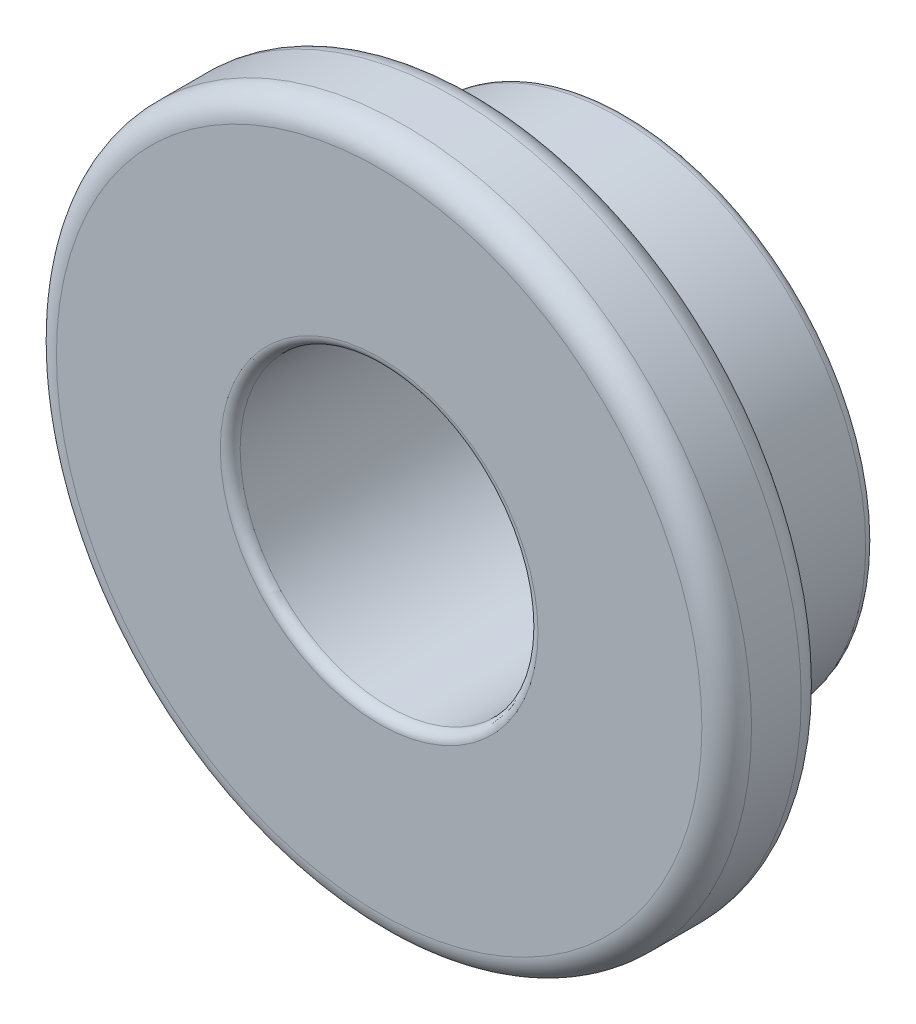
ISO-10303-21;
HEADER;
FILE_DESCRIPTION(('STEP AP214'),'2;1');
FILE_NAME('part.step','',(''),(''),'','','');
FILE_SCHEMA(('AUTOMOTIVE_DESIGN { 1 0 10303 214 1 1 1 1 }'));
ENDSEC;
DATA;
#1=APPLICATION_CONTEXT('core data for automotive mechanical design processes');
#2=APPLICATION_PROTOCOL_DEFINITION('international standard','automotive_design',2000,#1);
#3=PRODUCT_CONTEXT('',#1,'mechanical');
#4=PRODUCT('Part','Part','',(#3));
#5=PRODUCT_RELATED_PRODUCT_CATEGORY('part','',(#4));
#6=PRODUCT_DEFINITION_FORMATION('','',#4);
#7=PRODUCT_DEFINITION_CONTEXT('part definition',#1,'design');
#8=PRODUCT_DEFINITION('design','',#6,#7);
#9=PRODUCT_DEFINITION_SHAPE('','',#8);
#10=(LENGTH_UNIT() NAMED_UNIT(*) SI_UNIT(.MILLI.,.METRE.));
#11=(NAMED_UNIT(*) PLANE_ANGLE_UNIT() SI_UNIT($,.RADIAN.));
#12=(NAMED_UNIT(*) SI_UNIT($,.STERADIAN.) SOLID_ANGLE_UNIT());
#13=UNCERTAINTY_MEASURE_WITH_UNIT(LENGTH_MEASURE(1.E-05),#10,'distance_accuracy_value','');
#14=(GEOMETRIC_REPRESENTATION_CONTEXT(3) GLOBAL_UNCERTAINTY_ASSIGNED_CONTEXT((#13)) GLOBAL_UNIT_ASSIGNED_CONTEXT((#10,
#11,#12)) REPRESENTATION_CONTEXT('',''));
#15=CARTESIAN_POINT('',(0.,0.,0.));
#16=DIRECTION('',(0.,0.,1.));
#17=DIRECTION('',(1.,0.,0.));
#18=AXIS2_PLACEMENT_3D('',#15,#16,#17);
#19=CARTESIAN_POINT('',(0.,0.,2.));
#20=DIRECTION('',(0.,0.,-1.));
#21=DIRECTION('',(-1.,0.,0.));
#22=AXIS2_PLACEMENT_3D('',#19,#20,#21);
#23=CYLINDRICAL_SURFACE('',#22,7.);
#24=CARTESIAN_POINT('',(0.,0.,0.5));
#25=DIRECTION('',(0.,0.,1.));
#26=DIRECTION('',(1.,0.,0.));
#27=AXIS2_PLACEMENT_3D('',#24,#25,#26);
#28=CIRCLE('',#27,7.);
#29=CARTESIAN_POINT('',(7.,0.,0.5));
#30=VERTEX_POINT('',#29);
#31=EDGE_CURVE('E69',#30,#30,#28,.T.);
#32=ORIENTED_EDGE('',*,*,#31,.T.);
#33=EDGE_LOOP('',(#32));
#34=FACE_BOUND('',#33,.T.);
#35=CARTESIAN_POINT('',(0.,0.,1.5));
#36=DIRECTION('',(0.,0.,1.));
#37=DIRECTION('',(1.,0.,0.));
#38=AXIS2_PLACEMENT_3D('',#35,#36,#37);
#39=CIRCLE('',#38,7.);
#40=CARTESIAN_POINT('',(7.,0.,1.5));
#41=VERTEX_POINT('',#40);
#42=EDGE_CURVE('E72',#41,#41,#39,.F.);
#43=ORIENTED_EDGE('',*,*,#42,.T.);
#44=EDGE_LOOP('',(#43));
#45=FACE_BOUND('',#44,.T.);
#46=ADVANCED_FACE('F37',(#34,#45),#23,.T.);
#47=CARTESIAN_POINT('',(0.,0.,2.));
#48=DIRECTION('',(0.,0.,1.));
#49=DIRECTION('',(1.,0.,0.));
#50=AXIS2_PLACEMENT_3D('',#47,#48,#49);
#51=PLANE('',#50);
#52=CARTESIAN_POINT('',(0.,0.,2.));
#53=DIRECTION('',(0.,0.,1.));
#54=DIRECTION('',(1.,0.,0.));
#55=AXIS2_PLACEMENT_3D('',#52,#53,#54);
#56=CIRCLE('',#55,3.19999999999999);
#57=CARTESIAN_POINT('',(3.19999999999999,0.,2.));
#58=VERTEX_POINT('',#57);
#59=EDGE_CURVE('E52',#58,#58,#56,.F.);
#60=ORIENTED_EDGE('',*,*,#59,.T.);
#61=EDGE_LOOP('',(#60));
#62=FACE_BOUND('',#61,.T.);
#63=CARTESIAN_POINT('',(0.,0.,2.));
#64=DIRECTION('',(0.,0.,1.));
#65=DIRECTION('',(1.,0.,0.));
#66=AXIS2_PLACEMENT_3D('',#63,#64,#65);
#67=CIRCLE('',#66,6.5);
#68=CARTESIAN_POINT('',(6.5,0.,2.));
#69=VERTEX_POINT('',#68);
#70=EDGE_CURVE('E63',#69,#69,#67,.T.);
#71=ORIENTED_EDGE('',*,*,#70,.T.);
#72=EDGE_LOOP('',(#71));
#73=FACE_BOUND('',#72,.T.);
#74=ADVANCED_FACE('F92',(#62,#73),#51,.T.);
#75=CARTESIAN_POINT('',(0.,0.,0.));
#76=DIRECTION('',(0.,0.,1.));
#77=DIRECTION('',(1.,0.,0.));
#78=AXIS2_PLACEMENT_3D('',#75,#76,#77);
#79=PLANE('',#78);
#80=CARTESIAN_POINT('',(0.,0.,0.));
#81=DIRECTION('',(0.,0.,1.));
#82=DIRECTION('',(1.,0.,0.));
#83=AXIS2_PLACEMENT_3D('',#80,#81,#82);
#84=CIRCLE('',#83,6.5);
#85=CARTESIAN_POINT('',(6.5,0.,0.));
#86=VERTEX_POINT('',#85);
#87=EDGE_CURVE('E66',#86,#86,#84,.F.);
#88=ORIENTED_EDGE('',*,*,#87,.T.);
#89=EDGE_LOOP('',(#88));
#90=FACE_BOUND('',#89,.T.);
#91=CARTESIAN_POINT('',(0.,0.,0.));
#92=DIRECTION('',(0.,0.,1.));
#93=DIRECTION('',(1.,0.,0.));
#94=AXIS2_PLACEMENT_3D('',#91,#92,#93);
#95=CIRCLE('',#94,5.);
#96=CARTESIAN_POINT('',(5.,0.,0.));
#97=VERTEX_POINT('',#96);
#98=EDGE_CURVE('E75',#97,#97,#95,.T.);
#99=ORIENTED_EDGE('',*,*,#98,.T.);
#100=EDGE_LOOP('',(#99));
#101=FACE_BOUND('',#100,.T.);
#102=ADVANCED_FACE('F79',(#90,#101),#79,.F.);
#103=CARTESIAN_POINT('',(0.,0.,-3.));
#104=DIRECTION('',(0.,0.,1.));
#105=DIRECTION('',(1.,0.,0.));
#106=AXIS2_PLACEMENT_3D('',#103,#104,#105);
#107=CYLINDRICAL_SURFACE('',#106,5.);
#108=CARTESIAN_POINT('',(0.,0.,-2.8));
#109=DIRECTION('',(0.,0.,1.));
#110=DIRECTION('',(1.,0.,0.));
#111=AXIS2_PLACEMENT_3D('',#108,#109,#110);
#112=CIRCLE('',#111,5.);
#113=CARTESIAN_POINT('',(5.,0.,-2.8));
#114=VERTEX_POINT('',#113);
#115=EDGE_CURVE('E10',#114,#114,#112,.T.);
#116=ORIENTED_EDGE('',*,*,#115,.T.);
#117=EDGE_LOOP('',(#116));
#118=FACE_BOUND('',#117,.T.);
#119=ORIENTED_EDGE('',*,*,#98,.F.);
#120=EDGE_LOOP('',(#119));
#121=FACE_BOUND('',#120,.T.);
#122=ADVANCED_FACE('F81',(#118,#121),#107,.T.);
#123=CARTESIAN_POINT('',(0.,0.,-3.));
#124=DIRECTION('',(0.,0.,1.));
#125=DIRECTION('',(1.,0.,0.));
#126=AXIS2_PLACEMENT_3D('',#123,#124,#125);
#127=PLANE('',#126);
#128=CARTESIAN_POINT('',(0.,0.,-3.));
#129=DIRECTION('',(0.,0.,1.));
#130=DIRECTION('',(1.,0.,0.));
#131=AXIS2_PLACEMENT_3D('',#128,#129,#130);
#132=CIRCLE('',#131,3.19999999999999);
#133=CARTESIAN_POINT('',(3.19999999999999,0.,-3.));
#134=VERTEX_POINT('',#133);
#135=EDGE_CURVE('E44',#134,#134,#132,.T.);
#136=ORIENTED_EDGE('',*,*,#135,.T.);
#137=EDGE_LOOP('',(#136));
#138=FACE_BOUND('',#137,.T.);
#139=CARTESIAN_POINT('',(0.,0.,-3.));
#140=DIRECTION('',(0.,0.,1.));
#141=DIRECTION('',(1.,0.,0.));
#142=AXIS2_PLACEMENT_3D('',#139,#140,#141);
#143=CIRCLE('',#142,4.8);
#144=CARTESIAN_POINT('',(4.8,0.,-3.));
#145=VERTEX_POINT('',#144);
#146=EDGE_CURVE('E48',#145,#145,#143,.F.);
#147=ORIENTED_EDGE('',*,*,#146,.T.);
#148=EDGE_LOOP('',(#147));
#149=FACE_BOUND('',#148,.T.);
#150=ADVANCED_FACE('F83',(#138,#149),#127,.F.);
#151=CARTESIAN_POINT('',(0.,0.,2.));
#152=DIRECTION('',(0.,0.,1.));
#153=DIRECTION('',(1.,0.,0.));
#154=AXIS2_PLACEMENT_3D('',#151,#152,#153);
#155=CYLINDRICAL_SURFACE('',#154,2.99999999999999);
#156=CARTESIAN_POINT('',(0.,0.,1.8));
#157=DIRECTION('',(0.,0.,1.));
#158=DIRECTION('',(1.,0.,0.));
#159=AXIS2_PLACEMENT_3D('',#156,#157,#158);
#160=CIRCLE('',#159,2.99999999999999);
#161=CARTESIAN_POINT('',(2.99999999999999,0.,1.8));
#162=VERTEX_POINT('',#161);
#163=EDGE_CURVE('E57',#162,#162,#160,.T.);
#164=ORIENTED_EDGE('',*,*,#163,.T.);
#165=EDGE_LOOP('',(#164));
#166=FACE_BOUND('',#165,.T.);
#167=CARTESIAN_POINT('',(0.,0.,-2.8));
#168=DIRECTION('',(0.,0.,1.));
#169=DIRECTION('',(1.,0.,0.));
#170=AXIS2_PLACEMENT_3D('',#167,#168,#169);
#171=CIRCLE('',#170,2.99999999999999);
#172=CARTESIAN_POINT('',(2.99999999999999,0.,-2.8));
#173=VERTEX_POINT('',#172);
#174=EDGE_CURVE('E60',#173,#173,#171,.F.);
#175=ORIENTED_EDGE('',*,*,#174,.T.);
#176=EDGE_LOOP('',(#175));
#177=FACE_BOUND('',#176,.T.);
#178=ADVANCED_FACE('F89',(#166,#177),#155,.F.);
#179=CARTESIAN_POINT('',(0.,0.,0.5));
#180=DIRECTION('',(0.,0.,1.));
#181=DIRECTION('',(1.,0.,0.));
#182=AXIS2_PLACEMENT_3D('',#179,#180,#181);
#183=TOROIDAL_SURFACE('',#182,6.5,0.5);
#184=ORIENTED_EDGE('',*,*,#87,.F.);
#185=EDGE_LOOP('',(#184));
#186=FACE_BOUND('',#185,.T.);
#187=ORIENTED_EDGE('',*,*,#31,.F.);
#188=EDGE_LOOP('',(#187));
#189=FACE_BOUND('',#188,.T.);
#190=ADVANCED_FACE('F104',(#186,#189),#183,.T.);
#191=CARTESIAN_POINT('',(0.,0.,1.5));
#192=DIRECTION('',(0.,0.,1.));
#193=DIRECTION('',(1.,0.,0.));
#194=AXIS2_PLACEMENT_3D('',#191,#192,#193);
#195=TOROIDAL_SURFACE('',#194,6.5,0.5);
#196=ORIENTED_EDGE('',*,*,#42,.F.);
#197=EDGE_LOOP('',(#196));
#198=FACE_BOUND('',#197,.T.);
#199=ORIENTED_EDGE('',*,*,#70,.F.);
#200=EDGE_LOOP('',(#199));
#201=FACE_BOUND('',#200,.T.);
#202=ADVANCED_FACE('F107',(#198,#201),#195,.T.);
#203=CARTESIAN_POINT('',(0.,0.,1.8));
#204=DIRECTION('',(0.,0.,1.));
#205=DIRECTION('',(1.,0.,0.));
#206=AXIS2_PLACEMENT_3D('',#203,#204,#205);
#207=TOROIDAL_SURFACE('',#206,3.19999999999999,0.2);
#208=ORIENTED_EDGE('',*,*,#59,.F.);
#209=EDGE_LOOP('',(#208));
#210=FACE_BOUND('',#209,.T.);
#211=ORIENTED_EDGE('',*,*,#163,.F.);
#212=EDGE_LOOP('',(#211));
#213=FACE_BOUND('',#212,.T.);
#214=ADVANCED_FACE('F111',(#210,#213),#207,.T.);
#215=CARTESIAN_POINT('',(0.,0.,-2.8));
#216=DIRECTION('',(0.,0.,1.));
#217=DIRECTION('',(1.,0.,0.));
#218=AXIS2_PLACEMENT_3D('',#215,#216,#217);
#219=TOROIDAL_SURFACE('',#218,3.19999999999999,0.2);
#220=ORIENTED_EDGE('',*,*,#174,.F.);
#221=EDGE_LOOP('',(#220));
#222=FACE_BOUND('',#221,.T.);
#223=ORIENTED_EDGE('',*,*,#135,.F.);
#224=EDGE_LOOP('',(#223));
#225=FACE_BOUND('',#224,.T.);
#226=ADVANCED_FACE('F114',(#222,#225),#219,.T.);
#227=CARTESIAN_POINT('',(0.,0.,-2.8));
#228=DIRECTION('',(0.,0.,1.));
#229=DIRECTION('',(1.,0.,0.));
#230=AXIS2_PLACEMENT_3D('',#227,#228,#229);
#231=TOROIDAL_SURFACE('',#230,4.8,0.2);
#232=ORIENTED_EDGE('',*,*,#146,.F.);
#233=EDGE_LOOP('',(#232));
#234=FACE_BOUND('',#233,.T.);
#235=ORIENTED_EDGE('',*,*,#115,.F.);
#236=EDGE_LOOP('',(#235));
#237=FACE_BOUND('',#236,.T.);
#238=ADVANCED_FACE('F39',(#234,#237),#231,.T.);
#239=CLOSED_SHELL('',(#46,#74,#102,#122,#150,#178,#190,#202,#214,#226,#238));
#240=MANIFOLD_SOLID_BREP('B2',#239);
#241=ADVANCED_BREP_SHAPE_REPRESENTATION('',(#18,#240),#14);
#242=SHAPE_DEFINITION_REPRESENTATION(#9,#241);
ENDSEC;
END-ISO-10303-21;
